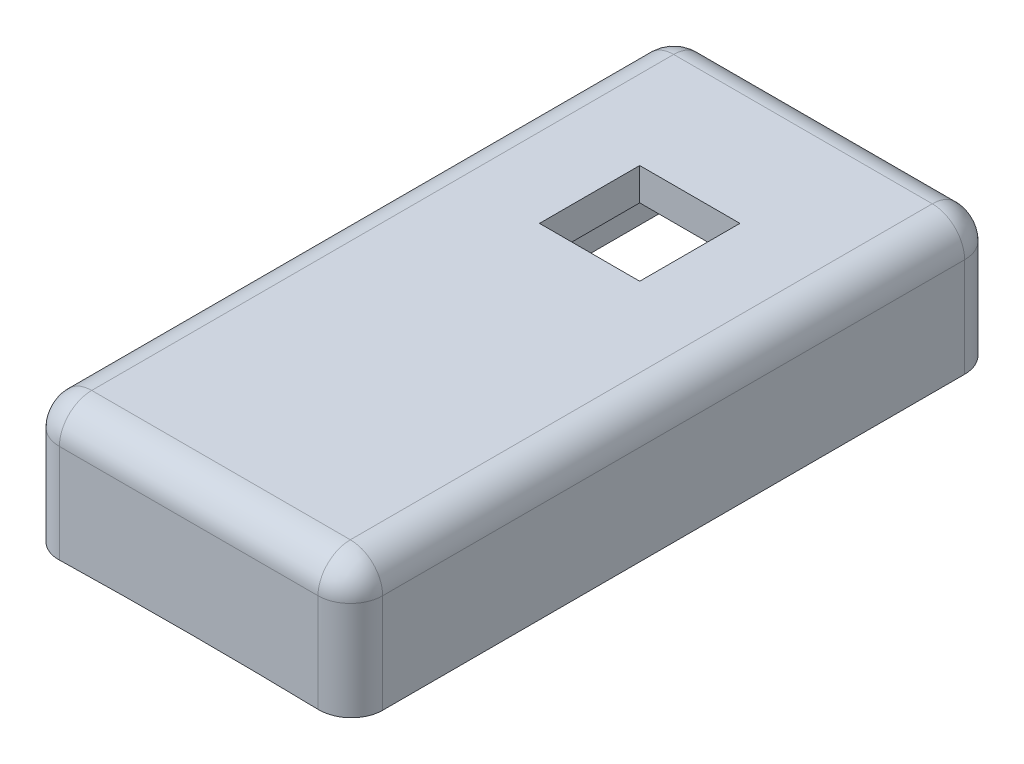
ISO-10303-21;
HEADER;
FILE_DESCRIPTION(('STEP AP214'),'2;1');
FILE_NAME('part.step','',(''),(''),'','','');
FILE_SCHEMA(('AUTOMOTIVE_DESIGN { 1 0 10303 214 1 1 1 1 }'));
ENDSEC;
DATA;
#1=APPLICATION_CONTEXT('core data for automotive mechanical design processes');
#2=APPLICATION_PROTOCOL_DEFINITION('international standard','automotive_design',2000,#1);
#3=PRODUCT_CONTEXT('',#1,'mechanical');
#4=PRODUCT('Part','Part','',(#3));
#5=PRODUCT_RELATED_PRODUCT_CATEGORY('part','',(#4));
#6=PRODUCT_DEFINITION_FORMATION('','',#4);
#7=PRODUCT_DEFINITION_CONTEXT('part definition',#1,'design');
#8=PRODUCT_DEFINITION('design','',#6,#7);
#9=PRODUCT_DEFINITION_SHAPE('','',#8);
#10=(LENGTH_UNIT() NAMED_UNIT(*) SI_UNIT(.MILLI.,.METRE.));
#11=(NAMED_UNIT(*) PLANE_ANGLE_UNIT() SI_UNIT($,.RADIAN.));
#12=(NAMED_UNIT(*) SI_UNIT($,.STERADIAN.) SOLID_ANGLE_UNIT());
#13=UNCERTAINTY_MEASURE_WITH_UNIT(LENGTH_MEASURE(1.E-05),#10,'distance_accuracy_value','');
#14=(GEOMETRIC_REPRESENTATION_CONTEXT(3) GLOBAL_UNCERTAINTY_ASSIGNED_CONTEXT((#13)) GLOBAL_UNIT_ASSIGNED_CONTEXT((#10,
#11,#12)) REPRESENTATION_CONTEXT('',''));
#15=CARTESIAN_POINT('',(0.,0.,0.));
#16=DIRECTION('',(0.,0.,1.));
#17=DIRECTION('',(1.,0.,0.));
#18=AXIS2_PLACEMENT_3D('',#15,#16,#17);
#19=CARTESIAN_POINT('',(0.,0.,100.));
#20=DIRECTION('',(0.,0.,-1.));
#21=DIRECTION('',(-1.,0.,0.));
#22=AXIS2_PLACEMENT_3D('',#19,#20,#21);
#23=CYLINDRICAL_SURFACE('',#22,915.);
#24=CARTESIAN_POINT('',(-20.,914.781394651203,100.));
#25=CARTESIAN_POINT('',(-20.1406644672354,914.778319610533,100.000015104095));
#26=CARTESIAN_POINT('',(-20.2813260189755,914.775211530138,99.9940646869272));
#27=CARTESIAN_POINT('',(-20.5616413157131,914.768953561077,99.9703422736799));
#28=CARTESIAN_POINT('',(-20.7012951087995,914.765803674428,99.9525708455042));
#29=CARTESIAN_POINT('',(-20.9785025079675,914.759488435766,99.9053335951738));
#30=CARTESIAN_POINT('',(-21.1160576122501,914.756323097142,99.8758765638301));
#31=CARTESIAN_POINT('',(-21.3881965568778,914.750000580786,99.8054823829541));
#32=CARTESIAN_POINT('',(-21.5227804332649,914.746843402956,99.7645453727602));
#33=CARTESIAN_POINT('',(-21.7880626645365,914.740563186704,99.6714663898441));
#34=CARTESIAN_POINT('',(-21.9187598327197,914.737440158889,99.6193210341405));
#35=CARTESIAN_POINT('',(-22.1753446865855,914.731255923841,99.5041820314336));
#36=CARTESIAN_POINT('',(-22.3012305766207,914.728194739886,99.441184381565));
#37=CARTESIAN_POINT('',(-22.5471790056357,914.722165384271,99.3048389735648));
#38=CARTESIAN_POINT('',(-22.6672446845895,914.719197162771,99.2314968816218));
#39=CARTESIAN_POINT('',(-22.9008158418151,914.713379310018,99.0749284612639));
#40=CARTESIAN_POINT('',(-23.0143188878349,914.710529722843,98.9916985026642));
#41=CARTESIAN_POINT('',(-23.2338614513206,914.70497961759,98.8160055422579));
#42=CARTESIAN_POINT('',(-23.3399041902866,914.70227903528,98.7235465679535));
#43=CARTESIAN_POINT('',(-23.5438643153944,914.697051961293,98.529985755192));
#44=CARTESIAN_POINT('',(-23.641778659444,914.694525534853,98.4288807093821));
#45=CARTESIAN_POINT('',(-23.8287249848049,914.689674485408,98.2187937187042));
#46=CARTESIAN_POINT('',(-23.9177584604004,914.687349828461,98.1098131043094));
#47=CARTESIAN_POINT('',(-24.086357939033,914.68292565125,97.8846944373414));
#48=CARTESIAN_POINT('',(-24.1659205652064,914.680826211314,97.7685538541275));
#49=CARTESIAN_POINT('',(-24.3149560191965,914.676876537278,97.5300056068566));
#50=CARTESIAN_POINT('',(-24.3844313432539,914.675026241534,97.4075995034641));
#51=CARTESIAN_POINT('',(-24.5128206631222,914.671594480255,97.1573656371529));
#52=CARTESIAN_POINT('',(-24.5717346177683,914.670013015769,97.0295378531047));
#53=CARTESIAN_POINT('',(-24.6785554039099,914.667137138383,96.7694270748727));
#54=CARTESIAN_POINT('',(-24.7264675610549,914.665842586608,96.6371462719744));
#55=CARTESIAN_POINT('',(-24.8109687207627,914.663554325449,96.3690654912981));
#56=CARTESIAN_POINT('',(-24.8475601992192,914.662560550284,96.2332662900641));
#57=CARTESIAN_POINT('',(-24.9187703604413,914.660623704798,95.9163109950664));
#58=CARTESIAN_POINT('',(-24.9492304166339,914.659792682776,95.7341929124362));
#59=CARTESIAN_POINT('',(-24.9796885526703,914.65896116833,95.4595566875088));
#60=CARTESIAN_POINT('',(-24.987302599877,914.658753167071,95.367814751134));
#61=CARTESIAN_POINT('',(-24.9974577189766,914.658475674299,95.1840560452749));
#62=CARTESIAN_POINT('',(-24.9999991080133,914.658406174125,95.0920392933324));
#63=CARTESIAN_POINT('',(-25.,914.65840618233,95.));
#64=B_SPLINE_CURVE_WITH_KNOTS('',3,(#24,#25,#26,#27,#28,#29,#30,#31,#32,#33,#34,#35,#36,#37,#38,
#39,#40,#41,#42,#43,#44,#45,#46,#47,#48,#49,#50,#51,#52,#53,#54,#55,#56,#57,#58,#59,#60,#61,#62,
#63),.UNSPECIFIED.,.F.,.F.,(4,2,2,2,2,2,2,2,2,2,2,2,2,2,2,2,2,2,2,4),(0.,0.421965357240429,
0.843910443932428,1.26553871113398,1.68716186103798,2.10891244734571,2.53081893062305,
2.95249520485927,3.37432677256357,3.79597505300436,4.21778043259154,4.63951471956947,
5.06139892977495,5.48317856037647,5.90495983490047,6.32653650495272,6.74802090861845,
7.30068785873599,7.57674290872782,7.85278069915381),.UNSPECIFIED.);
#65=CARTESIAN_POINT('',(-20.,914.781394651203,100.));
#66=VERTEX_POINT('',#65);
#67=CARTESIAN_POINT('',(-25.,914.65840618233,95.));
#68=VERTEX_POINT('',#67);
#69=EDGE_CURVE('E319',#66,#68,#64,.T.);
#70=ORIENTED_EDGE('',*,*,#69,.T.);
#71=CARTESIAN_POINT('',(0.,0.,95.));
#72=DIRECTION('',(0.,0.,1.));
#73=DIRECTION('',(1.,0.,0.));
#74=AXIS2_PLACEMENT_3D('',#71,#72,#73);
#75=CIRCLE('',#74,915.);
#76=CARTESIAN_POINT('',(20.,914.781394651203,95.));
#77=VERTEX_POINT('',#76);
#78=EDGE_CURVE('E230',#77,#68,#75,.T.);
#79=ORIENTED_EDGE('',*,*,#78,.F.);
#80=DIRECTION('',(0.,0.,-1.));
#81=VECTOR('',#80,1.);
#82=CARTESIAN_POINT('',(20.,914.781394651203,100.));
#83=LINE('',#82,#81);
#84=CARTESIAN_POINT('',(20.,914.781394651203,4.99999999999998));
#85=VERTEX_POINT('',#84);
#86=EDGE_CURVE('E233',#85,#77,#83,.F.);
#87=ORIENTED_EDGE('',*,*,#86,.F.);
#88=CARTESIAN_POINT('',(0.,0.,4.99999999999998));
#89=DIRECTION('',(0.,0.,-1.));
#90=DIRECTION('',(-1.,0.,0.));
#91=AXIS2_PLACEMENT_3D('',#88,#89,#90);
#92=CIRCLE('',#91,915.);
#93=CARTESIAN_POINT('',(-20.,914.781394651203,4.99999999999998));
#94=VERTEX_POINT('',#93);
#95=EDGE_CURVE('E238',#94,#85,#92,.T.);
#96=ORIENTED_EDGE('',*,*,#95,.F.);
#97=DIRECTION('',(0.,0.,-1.));
#98=VECTOR('',#97,1.);
#99=CARTESIAN_POINT('',(-20.,914.781394651203,100.));
#100=LINE('',#99,#98);
#101=CARTESIAN_POINT('',(-20.,914.781394651203,80.));
#102=VERTEX_POINT('',#101);
#103=EDGE_CURVE('E241',#102,#94,#100,.T.);
#104=ORIENTED_EDGE('',*,*,#103,.F.);
#105=CARTESIAN_POINT('',(0.,0.,80.));
#106=DIRECTION('',(0.,0.,-1.));
#107=DIRECTION('',(-1.,0.,0.));
#108=AXIS2_PLACEMENT_3D('',#105,#106,#107);
#109=CIRCLE('',#108,915.);
#110=CARTESIAN_POINT('',(-25.,914.65840618233,80.));
#111=VERTEX_POINT('',#110);
#112=EDGE_CURVE('E375',#111,#102,#109,.T.);
#113=ORIENTED_EDGE('',*,*,#112,.F.);
#114=DIRECTION('',(0.,0.,-1.));
#115=VECTOR('',#114,1.);
#116=CARTESIAN_POINT('',(-25.,914.65840618233,100.));
#117=LINE('',#116,#115);
#118=CARTESIAN_POINT('',(-25.,914.65840618233,5.));
#119=VERTEX_POINT('',#118);
#120=EDGE_CURVE('E249',#111,#119,#117,.T.);
#121=ORIENTED_EDGE('',*,*,#120,.T.);
#122=CARTESIAN_POINT('',(-25.,914.65840618233,5.));
#123=CARTESIAN_POINT('',(-25.0000151500655,914.658405523971,4.85940565498046));
#124=CARTESIAN_POINT('',(-24.9940706053862,914.658568240483,4.7188135037489));
#125=CARTESIAN_POINT('',(-24.9703715631628,914.659215666626,4.43863544517455));
#126=CARTESIAN_POINT('',(-24.9526176424691,914.659700360531,4.29904948901896));
#127=CARTESIAN_POINT('',(-24.9054273719519,914.660986492212,4.02197806077414));
#128=CARTESIAN_POINT('',(-24.8759999942426,914.661787686728,3.8844910595297));
#129=CARTESIAN_POINT('',(-24.8056773368275,914.66369755027,3.61248595673334));
#130=CARTESIAN_POINT('',(-24.7647821951351,914.664806215597,3.4779678194725));
#131=CARTESIAN_POINT('',(-24.6717998048681,914.66731900392,3.21281472629095));
#132=CARTESIAN_POINT('',(-24.6197092259708,914.66872321483,3.08218093904498));
#133=CARTESIAN_POINT('',(-24.5046930582283,914.671811814179,2.82571899391899));
#134=CARTESIAN_POINT('',(-24.4417634715222,914.67349630599,2.69989263020681));
#135=CARTESIAN_POINT('',(-24.3055676598232,914.677125556613,2.4540576296132));
#136=CARTESIAN_POINT('',(-24.2323070556181,914.67907017387,2.33404587657253));
#137=CARTESIAN_POINT('',(-24.0759156644583,914.683200022394,2.10057585809348));
#138=CARTESIAN_POINT('',(-23.9927812511617,914.685385342041,1.9871200233217));
#139=CARTESIAN_POINT('',(-23.8172725125381,914.689972193725,1.76763697028814));
#140=CARTESIAN_POINT('',(-23.7249000037434,914.692373683246,1.66160829853182));
#141=CARTESIAN_POINT('',(-23.5315220091746,914.697368984657,1.45766938668389));
#142=CARTESIAN_POINT('',(-23.4305133205398,914.699962867853,1.35976218531879));
#143=CARTESIAN_POINT('',(-23.2206284426376,914.705315076923,1.1728210426859));
#144=CARTESIAN_POINT('',(-23.1117535726432,914.708073375208,1.0837856194236));
#145=CARTESIAN_POINT('',(-22.8868551315034,914.713728177753,0.91517109753272));
#146=CARTESIAN_POINT('',(-22.7708290310888,914.716624730828,0.835595374121958));
#147=CARTESIAN_POINT('',(-22.532445629495,914.722527934553,0.686475758726517));
#148=CARTESIAN_POINT('',(-22.4100861233666,914.725534623438,0.616935392863884));
#149=CARTESIAN_POINT('',(-22.1599447501427,914.731628676084,0.488413528246855));
#150=CARTESIAN_POINT('',(-22.0321628583895,914.734716040212,0.429432077514362));
#151=CARTESIAN_POINT('',(-21.772141429631,914.740941880953,0.322472502716281));
#152=CARTESIAN_POINT('',(-21.6399040553157,914.744080332395,0.274489125988823));
#153=CARTESIAN_POINT('',(-21.3719072321286,914.750381011985,0.18984137658345));
#154=CARTESIAN_POINT('',(-21.2361485547716,914.753543234818,0.153174546791944));
#155=CARTESIAN_POINT('',(-20.9187676893903,914.760863613192,0.0816692081977026));
#156=CARTESIAN_POINT('',(-20.7361685641225,914.765021730698,0.0510445183005125));
#157=CARTESIAN_POINT('',(-20.4607983467186,914.771208655837,0.0204215585679653));
#158=CARTESIAN_POINT('',(-20.3688096302651,914.773261569656,0.0127662580230642));
#159=CARTESIAN_POINT('',(-20.1845549434616,914.777345716666,0.00255609823413704));
#160=CARTESIAN_POINT('',(-20.0922889911654,914.779376951231,9.13778196868483E-07));
#161=CARTESIAN_POINT('',(-20.,914.781394651203,0.));
#162=B_SPLINE_CURVE_WITH_KNOTS('',3,(#122,#123,#124,#125,#126,#127,#128,#129,#130,#131,#132,
#133,#134,#135,#136,#137,#138,#139,#140,#141,#142,#143,#144,#145,#146,#147,#148,#149,#150,#151,
#152,#153,#154,#155,#156,#157,#158,#159,#160,#161),.UNSPECIFIED.,.F.,.F.,(4,2,2,2,2,2,2,2,2,2,2,
2,2,2,2,2,2,2,2,4),(0.,0.421654227005286,0.843287859057121,1.26459805322751,1.68590317719354,
2.10733380128971,2.5289202000806,2.95027810538405,3.37179124363104,3.79322166002785,
4.21480905403933,4.63632590510775,5.05799270469331,5.47980730640222,5.90162382647356,
6.32323846593309,6.7447614974969,7.29905805460504,7.57592811309421,7.85278051623653),.UNSPECIFIED.);
#163=CARTESIAN_POINT('',(-20.,914.781394651203,0.));
#164=VERTEX_POINT('',#163);
#165=EDGE_CURVE('E58',#119,#164,#162,.T.);
#166=ORIENTED_EDGE('',*,*,#165,.T.);
#167=CARTESIAN_POINT('',(0.,0.,0.));
#168=DIRECTION('',(0.,0.,1.));
#169=DIRECTION('',(1.,0.,0.));
#170=AXIS2_PLACEMENT_3D('',#167,#168,#169);
#171=CIRCLE('',#170,915.);
#172=CARTESIAN_POINT('',(20.,914.781394651203,0.));
#173=VERTEX_POINT('',#172);
#174=EDGE_CURVE('E244',#173,#164,#171,.T.);
#175=ORIENTED_EDGE('',*,*,#174,.F.);
#176=CARTESIAN_POINT('',(20.,914.781394651203,0.));
#177=CARTESIAN_POINT('',(20.1406644672354,914.778319610533,-1.51040950419277E-05));
#178=CARTESIAN_POINT('',(20.2813260189755,914.775211530138,0.00593531307278657));
#179=CARTESIAN_POINT('',(20.5616413157131,914.768953561077,0.0296577263200531));
#180=CARTESIAN_POINT('',(20.7012951087995,914.765803674428,0.0474291544958041));
#181=CARTESIAN_POINT('',(20.9785025079675,914.759488435766,0.0946664048262205));
#182=CARTESIAN_POINT('',(21.1160576122501,914.756323097142,0.124123436169895));
#183=CARTESIAN_POINT('',(21.3881965568778,914.750000580786,0.194517617045909));
#184=CARTESIAN_POINT('',(21.5227804332649,914.746843402956,0.235454627239843));
#185=CARTESIAN_POINT('',(21.7880626645365,914.740563186704,0.328533610155889));
#186=CARTESIAN_POINT('',(21.9187598327197,914.737440158889,0.380678965859513));
#187=CARTESIAN_POINT('',(22.1753446865854,914.731255923841,0.495817968566393));
#188=CARTESIAN_POINT('',(22.3012305766207,914.728194739886,0.558815618434986));
#189=CARTESIAN_POINT('',(22.5471790056357,914.722165384271,0.695161026435217));
#190=CARTESIAN_POINT('',(22.6672446845895,914.719197162771,0.76850311837824));
#191=CARTESIAN_POINT('',(22.9008158418151,914.713379310018,0.925071538736074));
#192=CARTESIAN_POINT('',(23.0143188878349,914.710529722843,1.00830149733582));
#193=CARTESIAN_POINT('',(23.2338614513206,914.70497961759,1.18399445774212));
#194=CARTESIAN_POINT('',(23.3399041902866,914.70227903528,1.27645343204646));
#195=CARTESIAN_POINT('',(23.5438643153944,914.697051961293,1.47001424480804));
#196=CARTESIAN_POINT('',(23.641778659444,914.694525534853,1.5711192906179));
#197=CARTESIAN_POINT('',(23.8287249848049,914.689674485408,1.78120628129581));
#198=CARTESIAN_POINT('',(23.9177584604004,914.687349828461,1.89018689569062));
#199=CARTESIAN_POINT('',(24.086357939033,914.68292565125,2.11530556265864));
#200=CARTESIAN_POINT('',(24.1659205652064,914.680826211314,2.23144614587253));
#201=CARTESIAN_POINT('',(24.3149560191965,914.676876537278,2.46999439314335));
#202=CARTESIAN_POINT('',(24.3844313432539,914.675026241534,2.59240049653593));
#203=CARTESIAN_POINT('',(24.5128206631222,914.671594480255,2.84263436284712));
#204=CARTESIAN_POINT('',(24.5717346177683,914.670013015769,2.97046214689526));
#205=CARTESIAN_POINT('',(24.6785554039099,914.667137138383,3.23057292512726));
#206=CARTESIAN_POINT('',(24.7264675610549,914.665842586608,3.36285372802563));
#207=CARTESIAN_POINT('',(24.8109687207627,914.663554325449,3.63093450870186));
#208=CARTESIAN_POINT('',(24.8475601992192,914.662560550284,3.76673370993591));
#209=CARTESIAN_POINT('',(24.9187703604413,914.660623704798,4.08368900493355));
#210=CARTESIAN_POINT('',(24.9492304166338,914.659792682776,4.26580708756378));
#211=CARTESIAN_POINT('',(24.9796885526703,914.65896116833,4.54044331249123));
#212=CARTESIAN_POINT('',(24.987302599877,914.658753167071,4.63218524886599));
#213=CARTESIAN_POINT('',(24.9974577189766,914.658475674299,4.81594395472508));
#214=CARTESIAN_POINT('',(24.9999991080133,914.658406174125,4.90796070666762));
#215=CARTESIAN_POINT('',(25.,914.65840618233,5.));
#216=B_SPLINE_CURVE_WITH_KNOTS('',3,(#176,#177,#178,#179,#180,#181,#182,#183,#184,#185,#186,
#187,#188,#189,#190,#191,#192,#193,#194,#195,#196,#197,#198,#199,#200,#201,#202,#203,#204,#205,
#206,#207,#208,#209,#210,#211,#212,#213,#214,#215),.UNSPECIFIED.,.F.,.F.,(4,2,2,2,2,2,2,2,2,2,2,
2,2,2,2,2,2,2,2,4),(0.,0.421965357240425,0.843910443932423,1.26553871113397,1.68716186103797,
2.1089124473457,2.53081893062304,2.95249520485927,3.37432677256357,3.79597505300435,
4.21778043259155,4.63951471956947,5.06139892977494,5.48317856037646,5.90495983490046,
6.32653650495271,6.74802090861844,7.30068785873598,7.5767429087278,7.85278069915381),.UNSPECIFIED.);
#217=CARTESIAN_POINT('',(25.,914.65840618233,5.));
#218=VERTEX_POINT('',#217);
#219=EDGE_CURVE('E11',#173,#218,#216,.T.);
#220=ORIENTED_EDGE('',*,*,#219,.T.);
#221=DIRECTION('',(0.,0.,-1.));
#222=VECTOR('',#221,1.);
#223=CARTESIAN_POINT('',(25.,914.65840618233,100.));
#224=LINE('',#223,#222);
#225=CARTESIAN_POINT('',(25.,914.65840618233,95.));
#226=VERTEX_POINT('',#225);
#227=EDGE_CURVE('E255',#226,#218,#224,.T.);
#228=ORIENTED_EDGE('',*,*,#227,.F.);
#229=CARTESIAN_POINT('',(25.,914.65840618233,95.));
#230=CARTESIAN_POINT('',(25.0000151500655,914.658405523971,95.1405943450196));
#231=CARTESIAN_POINT('',(24.9940706053862,914.658568240483,95.2811864962511));
#232=CARTESIAN_POINT('',(24.9703715631628,914.659215666626,95.5613645548255));
#233=CARTESIAN_POINT('',(24.9526176424691,914.659700360531,95.7009505109811));
#234=CARTESIAN_POINT('',(24.9054273719519,914.660986492212,95.9780219392259));
#235=CARTESIAN_POINT('',(24.8759999942426,914.661787686728,96.1155089404703));
#236=CARTESIAN_POINT('',(24.8056773368275,914.66369755027,96.3875140432667));
#237=CARTESIAN_POINT('',(24.7647821951351,914.664806215597,96.5220321805275));
#238=CARTESIAN_POINT('',(24.6717998048681,914.66731900392,96.7871852737091));
#239=CARTESIAN_POINT('',(24.6197092259708,914.66872321483,96.917819060955));
#240=CARTESIAN_POINT('',(24.5046930582283,914.671811814179,97.174281006081));
#241=CARTESIAN_POINT('',(24.4417634715222,914.67349630599,97.3001073697932));
#242=CARTESIAN_POINT('',(24.3055676598232,914.677125556613,97.5459423703868));
#243=CARTESIAN_POINT('',(24.2323070556181,914.67907017387,97.6659541234275));
#244=CARTESIAN_POINT('',(24.0759156644583,914.683200022394,97.8994241419065));
#245=CARTESIAN_POINT('',(23.9927812511617,914.685385342041,98.0128799766783));
#246=CARTESIAN_POINT('',(23.8172725125381,914.689972193725,98.2323630297119));
#247=CARTESIAN_POINT('',(23.7249000037434,914.692373683246,98.3383917014682));
#248=CARTESIAN_POINT('',(23.5315220091746,914.697368984657,98.5423306133161));
#249=CARTESIAN_POINT('',(23.4305133205398,914.699962867853,98.6402378146812));
#250=CARTESIAN_POINT('',(23.2206284426376,914.705315076923,98.8271789573141));
#251=CARTESIAN_POINT('',(23.1117535726432,914.708073375208,98.9162143805764));
#252=CARTESIAN_POINT('',(22.8868551315034,914.713728177753,99.0848289024673));
#253=CARTESIAN_POINT('',(22.7708290310888,914.716624730828,99.164404625878));
#254=CARTESIAN_POINT('',(22.5324456294951,914.722527934553,99.3135242412735));
#255=CARTESIAN_POINT('',(22.4100861233666,914.725534623438,99.3830646071361));
#256=CARTESIAN_POINT('',(22.1599447501427,914.731628676084,99.5115864717531));
#257=CARTESIAN_POINT('',(22.0321628583895,914.734716040212,99.5705679224856));
#258=CARTESIAN_POINT('',(21.772141429631,914.740941880953,99.6775274972837));
#259=CARTESIAN_POINT('',(21.6399040553157,914.744080332395,99.7255108740112));
#260=CARTESIAN_POINT('',(21.3719072321286,914.750381011985,99.8101586234166));
#261=CARTESIAN_POINT('',(21.2361485547716,914.753543234818,99.8468254532081));
#262=CARTESIAN_POINT('',(20.9187676893903,914.760863613192,99.9183307918023));
#263=CARTESIAN_POINT('',(20.7361685641225,914.765021730698,99.9489554816995));
#264=CARTESIAN_POINT('',(20.4607983467186,914.771208655837,99.979578441432));
#265=CARTESIAN_POINT('',(20.3688096302651,914.773261569656,99.987233741977));
#266=CARTESIAN_POINT('',(20.1845549434616,914.777345716666,99.9974439017659));
#267=CARTESIAN_POINT('',(20.0922889911654,914.779376951231,99.9999990862218));
#268=CARTESIAN_POINT('',(20.,914.781394651203,100.));
#269=B_SPLINE_CURVE_WITH_KNOTS('',3,(#229,#230,#231,#232,#233,#234,#235,#236,#237,#238,#239,
#240,#241,#242,#243,#244,#245,#246,#247,#248,#249,#250,#251,#252,#253,#254,#255,#256,#257,#258,
#259,#260,#261,#262,#263,#264,#265,#266,#267,#268),.UNSPECIFIED.,.F.,.F.,(4,2,2,2,2,2,2,2,2,2,2,
2,2,2,2,2,2,2,2,4),(0.,0.421654227005288,0.84328785905713,1.26459805322752,1.68590317719353,
2.10733380128972,2.52892020008061,2.95027810538405,3.37179124363104,3.79322166002784,
4.21480905403932,4.63632590510775,5.05799270469331,5.47980730640222,5.90162382647356,
6.32323846593309,6.74476149749689,7.29905805460503,7.57592811309421,7.85278051623653),.UNSPECIFIED.);
#270=CARTESIAN_POINT('',(20.,914.781394651203,100.));
#271=VERTEX_POINT('',#270);
#272=EDGE_CURVE('E310',#226,#271,#269,.T.);
#273=ORIENTED_EDGE('',*,*,#272,.T.);
#274=CARTESIAN_POINT('',(0.,0.,100.));
#275=DIRECTION('',(0.,0.,1.));
#276=DIRECTION('',(1.,0.,0.));
#277=AXIS2_PLACEMENT_3D('',#274,#275,#276);
#278=CIRCLE('',#277,915.);
#279=EDGE_CURVE('E245',#271,#66,#278,.T.);
#280=ORIENTED_EDGE('',*,*,#279,.T.);
#281=EDGE_LOOP('',(#70,#79,#87,#96,#104,#113,#121,#166,#175,#220,#228,#273,#280));
#282=FACE_BOUND('',#281,.T.);
#283=ADVANCED_FACE('F47',(#282),#23,.F.);
#284=CARTESIAN_POINT('',(24.9999999999998,0.,100.));
#285=DIRECTION('',(1.,0.,0.));
#286=DIRECTION('',(0.,1.,0.));
#287=AXIS2_PLACEMENT_3D('',#284,#285,#286);
#288=PLANE('',#287);
#289=ORIENTED_EDGE('',*,*,#227,.T.);
#290=DIRECTION('',(0.,-1.,0.));
#291=VECTOR('',#290,1.);
#292=CARTESIAN_POINT('',(25.,935.,5.));
#293=LINE('',#292,#291);
#294=CARTESIAN_POINT('',(25.,930.,5.));
#295=VERTEX_POINT('',#294);
#296=EDGE_CURVE('E66',#218,#295,#293,.F.);
#297=ORIENTED_EDGE('',*,*,#296,.T.);
#298=DIRECTION('',(0.,0.,-1.));
#299=VECTOR('',#298,1.);
#300=CARTESIAN_POINT('',(25.,930.,100.));
#301=LINE('',#300,#299);
#302=CARTESIAN_POINT('',(25.,930.,95.));
#303=VERTEX_POINT('',#302);
#304=EDGE_CURVE('E71',#295,#303,#301,.F.);
#305=ORIENTED_EDGE('',*,*,#304,.T.);
#306=DIRECTION('',(0.,-1.,0.));
#307=VECTOR('',#306,1.);
#308=CARTESIAN_POINT('',(24.9999999999998,0.,95.));
#309=LINE('',#308,#307);
#310=EDGE_CURVE('E303',#303,#226,#309,.T.);
#311=ORIENTED_EDGE('',*,*,#310,.T.);
#312=EDGE_LOOP('',(#289,#297,#305,#311));
#313=FACE_BOUND('',#312,.T.);
#314=ADVANCED_FACE('F492',(#313),#288,.T.);
#315=CARTESIAN_POINT('',(0.,935.,100.));
#316=DIRECTION('',(0.,1.,0.));
#317=DIRECTION('',(0.,0.,1.));
#318=AXIS2_PLACEMENT_3D('',#315,#316,#317);
#319=PLANE('',#318);
#320=DIRECTION('',(0.,0.,-1.));
#321=VECTOR('',#320,1.);
#322=CARTESIAN_POINT('',(-20.,935.,100.));
#323=LINE('',#322,#321);
#324=CARTESIAN_POINT('',(-20.,935.,5.));
#325=VERTEX_POINT('',#324);
#326=CARTESIAN_POINT('',(-20.,935.,95.));
#327=VERTEX_POINT('',#326);
#328=EDGE_CURVE('E267',#325,#327,#323,.F.);
#329=ORIENTED_EDGE('',*,*,#328,.T.);
#330=DIRECTION('',(1.,0.,0.));
#331=VECTOR('',#330,1.);
#332=CARTESIAN_POINT('',(0.,935.,95.));
#333=LINE('',#332,#331);
#334=CARTESIAN_POINT('',(20.,935.,95.));
#335=VERTEX_POINT('',#334);
#336=EDGE_CURVE('E270',#327,#335,#333,.T.);
#337=ORIENTED_EDGE('',*,*,#336,.T.);
#338=DIRECTION('',(0.,0.,-1.));
#339=VECTOR('',#338,1.);
#340=CARTESIAN_POINT('',(20.,935.,100.));
#341=LINE('',#340,#339);
#342=CARTESIAN_POINT('',(20.,935.,5.));
#343=VERTEX_POINT('',#342);
#344=EDGE_CURVE('E261',#335,#343,#341,.T.);
#345=ORIENTED_EDGE('',*,*,#344,.T.);
#346=DIRECTION('',(1.,0.,0.));
#347=VECTOR('',#346,1.);
#348=CARTESIAN_POINT('',(-25.,935.,5.));
#349=LINE('',#348,#347);
#350=EDGE_CURVE('E264',#343,#325,#349,.F.);
#351=ORIENTED_EDGE('',*,*,#350,.T.);
#352=EDGE_LOOP('',(#329,#337,#345,#351));
#353=FACE_BOUND('',#352,.T.);
#354=DIRECTION('',(1.,0.,0.));
#355=VECTOR('',#354,1.);
#356=CARTESIAN_POINT('',(-7.75,935.,38.));
#357=LINE('',#356,#355);
#358=CARTESIAN_POINT('',(-7.75,935.,38.));
#359=VERTEX_POINT('',#358);
#360=CARTESIAN_POINT('',(7.75,935.,38.));
#361=VERTEX_POINT('',#360);
#362=EDGE_CURVE('E419',#359,#361,#357,.T.);
#363=ORIENTED_EDGE('',*,*,#362,.F.);
#364=DIRECTION('',(0.,0.,1.));
#365=VECTOR('',#364,1.);
#366=CARTESIAN_POINT('',(-7.75,935.,22.5));
#367=LINE('',#366,#365);
#368=CARTESIAN_POINT('',(-7.75,935.,22.5));
#369=VERTEX_POINT('',#368);
#370=EDGE_CURVE('E416',#369,#359,#367,.T.);
#371=ORIENTED_EDGE('',*,*,#370,.F.);
#372=DIRECTION('',(-1.,0.,0.));
#373=VECTOR('',#372,1.);
#374=CARTESIAN_POINT('',(-7.75,935.,22.5));
#375=LINE('',#374,#373);
#376=CARTESIAN_POINT('',(7.75,935.,22.5));
#377=VERTEX_POINT('',#376);
#378=EDGE_CURVE('E435',#377,#369,#375,.T.);
#379=ORIENTED_EDGE('',*,*,#378,.F.);
#380=DIRECTION('',(0.,0.,-1.));
#381=VECTOR('',#380,1.);
#382=CARTESIAN_POINT('',(7.75,935.,22.5));
#383=LINE('',#382,#381);
#384=EDGE_CURVE('E426',#361,#377,#383,.T.);
#385=ORIENTED_EDGE('',*,*,#384,.F.);
#386=EDGE_LOOP('',(#363,#371,#379,#385));
#387=FACE_BOUND('',#386,.T.);
#388=ADVANCED_FACE('F498',(#353,#387),#319,.T.);
#389=CARTESIAN_POINT('',(-24.9999999999998,0.,100.));
#390=DIRECTION('',(1.,0.,0.));
#391=DIRECTION('',(0.,1.,0.));
#392=AXIS2_PLACEMENT_3D('',#389,#390,#391);
#393=PLANE('',#392);
#394=ORIENTED_EDGE('',*,*,#120,.F.);
#395=DIRECTION('',(0.,-1.,0.));
#396=VECTOR('',#395,1.);
#397=CARTESIAN_POINT('',(-25.,914.65840618233,80.));
#398=LINE('',#397,#396);
#399=CARTESIAN_POINT('',(-25.,919.65840618233,80.));
#400=VERTEX_POINT('',#399);
#401=EDGE_CURVE('E212',#400,#111,#398,.T.);
#402=ORIENTED_EDGE('',*,*,#401,.F.);
#403=DIRECTION('',(0.,0.,-1.));
#404=VECTOR('',#403,1.);
#405=CARTESIAN_POINT('',(-25.,919.65840618233,95.));
#406=LINE('',#405,#404);
#407=CARTESIAN_POINT('',(-25.,919.65840618233,95.));
#408=VERTEX_POINT('',#407);
#409=EDGE_CURVE('E696',#408,#400,#406,.T.);
#410=ORIENTED_EDGE('',*,*,#409,.F.);
#411=DIRECTION('',(0.,-1.,0.));
#412=VECTOR('',#411,1.);
#413=CARTESIAN_POINT('',(-25.,935.,95.));
#414=LINE('',#413,#412);
#415=CARTESIAN_POINT('',(-25.,930.,95.));
#416=VERTEX_POINT('',#415);
#417=EDGE_CURVE('E284',#408,#416,#414,.F.);
#418=ORIENTED_EDGE('',*,*,#417,.T.);
#419=DIRECTION('',(0.,0.,-1.));
#420=VECTOR('',#419,1.);
#421=CARTESIAN_POINT('',(-25.,930.,0.));
#422=LINE('',#421,#420);
#423=CARTESIAN_POINT('',(-25.,930.,5.));
#424=VERTEX_POINT('',#423);
#425=EDGE_CURVE('E287',#416,#424,#422,.T.);
#426=ORIENTED_EDGE('',*,*,#425,.T.);
#427=DIRECTION('',(0.,-1.,0.));
#428=VECTOR('',#427,1.);
#429=CARTESIAN_POINT('',(-24.9999999999998,0.,5.));
#430=LINE('',#429,#428);
#431=EDGE_CURVE('E290',#424,#119,#430,.T.);
#432=ORIENTED_EDGE('',*,*,#431,.T.);
#433=EDGE_LOOP('',(#394,#402,#410,#418,#426,#432));
#434=FACE_BOUND('',#433,.T.);
#435=ADVANCED_FACE('F503',(#434),#393,.F.);
#436=CARTESIAN_POINT('',(0.,0.,100.));
#437=DIRECTION('',(0.,0.,1.));
#438=DIRECTION('',(1.,0.,0.));
#439=AXIS2_PLACEMENT_3D('',#436,#437,#438);
#440=PLANE('',#439);
#441=DIRECTION('',(1.,0.,0.));
#442=VECTOR('',#441,1.);
#443=CARTESIAN_POINT('',(0.,930.,100.));
#444=LINE('',#443,#442);
#445=CARTESIAN_POINT('',(20.,930.,100.));
#446=VERTEX_POINT('',#445);
#447=CARTESIAN_POINT('',(-20.,930.,100.));
#448=VERTEX_POINT('',#447);
#449=EDGE_CURVE('E277',#446,#448,#444,.F.);
#450=ORIENTED_EDGE('',*,*,#449,.T.);
#451=DIRECTION('',(0.,-1.,0.));
#452=VECTOR('',#451,1.);
#453=CARTESIAN_POINT('',(-20.,914.65840618233,100.));
#454=LINE('',#453,#452);
#455=EDGE_CURVE('E281',#448,#66,#454,.T.);
#456=ORIENTED_EDGE('',*,*,#455,.T.);
#457=ORIENTED_EDGE('',*,*,#279,.F.);
#458=DIRECTION('',(0.,-1.,0.));
#459=VECTOR('',#458,1.);
#460=CARTESIAN_POINT('',(19.9999999999998,0.,100.));
#461=LINE('',#460,#459);
#462=EDGE_CURVE('E274',#271,#446,#461,.F.);
#463=ORIENTED_EDGE('',*,*,#462,.T.);
#464=EDGE_LOOP('',(#450,#456,#457,#463));
#465=FACE_BOUND('',#464,.T.);
#466=ADVANCED_FACE('F508',(#465),#440,.T.);
#467=CARTESIAN_POINT('',(0.,0.,0.));
#468=DIRECTION('',(0.,0.,1.));
#469=DIRECTION('',(1.,0.,0.));
#470=AXIS2_PLACEMENT_3D('',#467,#468,#469);
#471=PLANE('',#470);
#472=DIRECTION('',(1.,0.,0.));
#473=VECTOR('',#472,1.);
#474=CARTESIAN_POINT('',(25.,930.,0.));
#475=LINE('',#474,#473);
#476=CARTESIAN_POINT('',(-20.,930.,0.));
#477=VERTEX_POINT('',#476);
#478=CARTESIAN_POINT('',(20.,930.,0.));
#479=VERTEX_POINT('',#478);
#480=EDGE_CURVE('E297',#477,#479,#475,.T.);
#481=ORIENTED_EDGE('',*,*,#480,.T.);
#482=DIRECTION('',(0.,-1.,0.));
#483=VECTOR('',#482,1.);
#484=CARTESIAN_POINT('',(20.,914.65840618233,0.));
#485=LINE('',#484,#483);
#486=EDGE_CURVE('E300',#479,#173,#485,.T.);
#487=ORIENTED_EDGE('',*,*,#486,.T.);
#488=ORIENTED_EDGE('',*,*,#174,.T.);
#489=DIRECTION('',(0.,-1.,0.));
#490=VECTOR('',#489,1.);
#491=CARTESIAN_POINT('',(-19.9999999999998,0.,0.));
#492=LINE('',#491,#490);
#493=EDGE_CURVE('E294',#164,#477,#492,.F.);
#494=ORIENTED_EDGE('',*,*,#493,.T.);
#495=EDGE_LOOP('',(#481,#487,#488,#494));
#496=FACE_BOUND('',#495,.T.);
#497=ADVANCED_FACE('F510',(#496),#471,.F.);
#498=CARTESIAN_POINT('',(-20.,785.,4.99999999999998));
#499=DIRECTION('',(-1.,0.,0.));
#500=DIRECTION('',(0.,0.,1.));
#501=AXIS2_PLACEMENT_3D('',#498,#499,#500);
#502=PLANE('',#501);
#503=DIRECTION('',(0.,0.,-1.));
#504=VECTOR('',#503,1.);
#505=CARTESIAN_POINT('',(-20.,919.65840618233,95.));
#506=LINE('',#505,#504);
#507=CARTESIAN_POINT('',(-20.,919.65840618233,95.));
#508=VERTEX_POINT('',#507);
#509=CARTESIAN_POINT('',(-20.,919.65840618233,80.));
#510=VERTEX_POINT('',#509);
#511=EDGE_CURVE('E206',#508,#510,#506,.T.);
#512=ORIENTED_EDGE('',*,*,#511,.T.);
#513=DIRECTION('',(0.,-1.,0.));
#514=VECTOR('',#513,1.);
#515=CARTESIAN_POINT('',(-20.,914.65840618233,80.));
#516=LINE('',#515,#514);
#517=EDGE_CURVE('E203',#510,#102,#516,.T.);
#518=ORIENTED_EDGE('',*,*,#517,.T.);
#519=ORIENTED_EDGE('',*,*,#103,.T.);
#520=DIRECTION('',(0.,1.,0.));
#521=VECTOR('',#520,1.);
#522=CARTESIAN_POINT('',(-20.,785.,4.99999999999998));
#523=LINE('',#522,#521);
#524=CARTESIAN_POINT('',(-20.,930.,4.99999999999998));
#525=VERTEX_POINT('',#524);
#526=EDGE_CURVE('E234',#94,#525,#523,.T.);
#527=ORIENTED_EDGE('',*,*,#526,.T.);
#528=DIRECTION('',(0.,0.,1.));
#529=VECTOR('',#528,1.);
#530=CARTESIAN_POINT('',(-20.,930.,4.99999999999998));
#531=LINE('',#530,#529);
#532=CARTESIAN_POINT('',(-20.,930.,95.));
#533=VERTEX_POINT('',#532);
#534=EDGE_CURVE('E217',#525,#533,#531,.T.);
#535=ORIENTED_EDGE('',*,*,#534,.T.);
#536=DIRECTION('',(0.,1.,0.));
#537=VECTOR('',#536,1.);
#538=CARTESIAN_POINT('',(-20.,785.,95.));
#539=LINE('',#538,#537);
#540=EDGE_CURVE('E194',#508,#533,#539,.T.);
#541=ORIENTED_EDGE('',*,*,#540,.F.);
#542=EDGE_LOOP('',(#512,#518,#519,#527,#535,#541));
#543=FACE_BOUND('',#542,.T.);
#544=ADVANCED_FACE('F215',(#543),#502,.F.);
#545=CARTESIAN_POINT('',(-20.,785.,4.99999999999998));
#546=DIRECTION('',(0.,0.,-1.));
#547=DIRECTION('',(-1.,0.,0.));
#548=AXIS2_PLACEMENT_3D('',#545,#546,#547);
#549=PLANE('',#548);
#550=DIRECTION('',(0.,1.,0.));
#551=VECTOR('',#550,1.);
#552=CARTESIAN_POINT('',(20.,785.,4.99999999999998));
#553=LINE('',#552,#551);
#554=CARTESIAN_POINT('',(20.,930.,4.99999999999998));
#555=VERTEX_POINT('',#554);
#556=EDGE_CURVE('E224',#85,#555,#553,.T.);
#557=ORIENTED_EDGE('',*,*,#556,.T.);
#558=DIRECTION('',(-1.,0.,0.));
#559=VECTOR('',#558,1.);
#560=CARTESIAN_POINT('',(-20.,930.,4.99999999999998));
#561=LINE('',#560,#559);
#562=EDGE_CURVE('E226',#555,#525,#561,.T.);
#563=ORIENTED_EDGE('',*,*,#562,.T.);
#564=ORIENTED_EDGE('',*,*,#526,.F.);
#565=ORIENTED_EDGE('',*,*,#95,.T.);
#566=EDGE_LOOP('',(#557,#563,#564,#565));
#567=FACE_BOUND('',#566,.T.);
#568=ADVANCED_FACE('F464',(#567),#549,.F.);
#569=CARTESIAN_POINT('',(20.,785.,4.99999999999998));
#570=DIRECTION('',(1.,0.,0.));
#571=DIRECTION('',(0.,0.,-1.));
#572=AXIS2_PLACEMENT_3D('',#569,#570,#571);
#573=PLANE('',#572);
#574=DIRECTION('',(0.,1.,0.));
#575=VECTOR('',#574,1.);
#576=CARTESIAN_POINT('',(20.,785.,95.));
#577=LINE('',#576,#575);
#578=CARTESIAN_POINT('',(20.,930.,95.));
#579=VERTEX_POINT('',#578);
#580=EDGE_CURVE('E219',#77,#579,#577,.T.);
#581=ORIENTED_EDGE('',*,*,#580,.T.);
#582=DIRECTION('',(0.,0.,-1.));
#583=VECTOR('',#582,1.);
#584=CARTESIAN_POINT('',(20.,930.,4.99999999999998));
#585=LINE('',#584,#583);
#586=EDGE_CURVE('E443',#579,#555,#585,.T.);
#587=ORIENTED_EDGE('',*,*,#586,.T.);
#588=ORIENTED_EDGE('',*,*,#556,.F.);
#589=ORIENTED_EDGE('',*,*,#86,.T.);
#590=EDGE_LOOP('',(#581,#587,#588,#589));
#591=FACE_BOUND('',#590,.T.);
#592=ADVANCED_FACE('F469',(#591),#573,.F.);
#593=CARTESIAN_POINT('',(-20.,785.,95.));
#594=DIRECTION('',(0.,0.,1.));
#595=DIRECTION('',(1.,0.,0.));
#596=AXIS2_PLACEMENT_3D('',#593,#594,#595);
#597=PLANE('',#596);
#598=ORIENTED_EDGE('',*,*,#78,.T.);
#599=EDGE_CURVE('E197',#68,#408,#414,.F.);
#600=ORIENTED_EDGE('',*,*,#599,.T.);
#601=DIRECTION('',(-1.,0.,0.));
#602=VECTOR('',#601,1.);
#603=CARTESIAN_POINT('',(-20.,919.65840618233,95.));
#604=LINE('',#603,#602);
#605=EDGE_CURVE('E189',#508,#408,#604,.T.);
#606=ORIENTED_EDGE('',*,*,#605,.F.);
#607=ORIENTED_EDGE('',*,*,#540,.T.);
#608=DIRECTION('',(1.,0.,0.));
#609=VECTOR('',#608,1.);
#610=CARTESIAN_POINT('',(-20.,930.,95.));
#611=LINE('',#610,#609);
#612=EDGE_CURVE('E258',#533,#579,#611,.T.);
#613=ORIENTED_EDGE('',*,*,#612,.T.);
#614=ORIENTED_EDGE('',*,*,#580,.F.);
#615=EDGE_LOOP('',(#598,#600,#606,#607,#613,#614));
#616=FACE_BOUND('',#615,.T.);
#617=ADVANCED_FACE('F191',(#616),#597,.F.);
#618=CARTESIAN_POINT('',(0.,930.,0.));
#619=DIRECTION('',(0.,-1.,0.));
#620=DIRECTION('',(0.,0.,-1.));
#621=AXIS2_PLACEMENT_3D('',#618,#619,#620);
#622=PLANE('',#621);
#623=DIRECTION('',(0.,0.,1.));
#624=VECTOR('',#623,1.);
#625=CARTESIAN_POINT('',(-7.75,930.,22.5));
#626=LINE('',#625,#624);
#627=CARTESIAN_POINT('',(-7.75,930.,22.5));
#628=VERTEX_POINT('',#627);
#629=CARTESIAN_POINT('',(-7.75,930.,38.));
#630=VERTEX_POINT('',#629);
#631=EDGE_CURVE('E439',#628,#630,#626,.T.);
#632=ORIENTED_EDGE('',*,*,#631,.T.);
#633=DIRECTION('',(1.,0.,0.));
#634=VECTOR('',#633,1.);
#635=CARTESIAN_POINT('',(-7.75,930.,38.));
#636=LINE('',#635,#634);
#637=CARTESIAN_POINT('',(7.75,930.,38.));
#638=VERTEX_POINT('',#637);
#639=EDGE_CURVE('E705',#630,#638,#636,.T.);
#640=ORIENTED_EDGE('',*,*,#639,.T.);
#641=DIRECTION('',(0.,0.,-1.));
#642=VECTOR('',#641,1.);
#643=CARTESIAN_POINT('',(7.75,930.,22.5));
#644=LINE('',#643,#642);
#645=CARTESIAN_POINT('',(7.75,930.,22.5));
#646=VERTEX_POINT('',#645);
#647=EDGE_CURVE('E708',#638,#646,#644,.T.);
#648=ORIENTED_EDGE('',*,*,#647,.T.);
#649=DIRECTION('',(-1.,0.,0.));
#650=VECTOR('',#649,1.);
#651=CARTESIAN_POINT('',(-7.75,930.,22.5));
#652=LINE('',#651,#650);
#653=EDGE_CURVE('E429',#646,#628,#652,.T.);
#654=ORIENTED_EDGE('',*,*,#653,.T.);
#655=EDGE_LOOP('',(#632,#640,#648,#654));
#656=FACE_BOUND('',#655,.T.);
#657=ORIENTED_EDGE('',*,*,#534,.F.);
#658=ORIENTED_EDGE('',*,*,#562,.F.);
#659=ORIENTED_EDGE('',*,*,#586,.F.);
#660=ORIENTED_EDGE('',*,*,#612,.F.);
#661=EDGE_LOOP('',(#657,#658,#659,#660));
#662=FACE_BOUND('',#661,.T.);
#663=ADVANCED_FACE('F476',(#656,#662),#622,.T.);
#664=CARTESIAN_POINT('',(-7.75,930.,22.5));
#665=DIRECTION('',(-1.,0.,0.));
#666=DIRECTION('',(0.,0.,1.));
#667=AXIS2_PLACEMENT_3D('',#664,#665,#666);
#668=PLANE('',#667);
#669=ORIENTED_EDGE('',*,*,#370,.T.);
#670=DIRECTION('',(0.,1.,0.));
#671=VECTOR('',#670,1.);
#672=CARTESIAN_POINT('',(-7.75,930.,38.));
#673=LINE('',#672,#671);
#674=EDGE_CURVE('E450',#630,#359,#673,.T.);
#675=ORIENTED_EDGE('',*,*,#674,.F.);
#676=ORIENTED_EDGE('',*,*,#631,.F.);
#677=DIRECTION('',(0.,1.,0.));
#678=VECTOR('',#677,1.);
#679=CARTESIAN_POINT('',(-7.75,930.,22.5));
#680=LINE('',#679,#678);
#681=EDGE_CURVE('E440',#628,#369,#680,.T.);
#682=ORIENTED_EDGE('',*,*,#681,.T.);
#683=EDGE_LOOP('',(#669,#675,#676,#682));
#684=FACE_BOUND('',#683,.T.);
#685=ADVANCED_FACE('F478',(#684),#668,.F.);
#686=CARTESIAN_POINT('',(-7.75,930.,22.5));
#687=DIRECTION('',(0.,0.,-1.));
#688=DIRECTION('',(-1.,0.,0.));
#689=AXIS2_PLACEMENT_3D('',#686,#687,#688);
#690=PLANE('',#689);
#691=ORIENTED_EDGE('',*,*,#378,.T.);
#692=ORIENTED_EDGE('',*,*,#681,.F.);
#693=ORIENTED_EDGE('',*,*,#653,.F.);
#694=DIRECTION('',(0.,1.,0.));
#695=VECTOR('',#694,1.);
#696=CARTESIAN_POINT('',(7.75,930.,22.5));
#697=LINE('',#696,#695);
#698=EDGE_CURVE('E444',#646,#377,#697,.T.);
#699=ORIENTED_EDGE('',*,*,#698,.T.);
#700=EDGE_LOOP('',(#691,#692,#693,#699));
#701=FACE_BOUND('',#700,.T.);
#702=ADVANCED_FACE('F485',(#701),#690,.F.);
#703=CARTESIAN_POINT('',(7.75,930.,22.5));
#704=DIRECTION('',(1.,0.,0.));
#705=DIRECTION('',(0.,0.,-1.));
#706=AXIS2_PLACEMENT_3D('',#703,#704,#705);
#707=PLANE('',#706);
#708=ORIENTED_EDGE('',*,*,#384,.T.);
#709=ORIENTED_EDGE('',*,*,#698,.F.);
#710=ORIENTED_EDGE('',*,*,#647,.F.);
#711=DIRECTION('',(0.,1.,0.));
#712=VECTOR('',#711,1.);
#713=CARTESIAN_POINT('',(7.75,930.,38.));
#714=LINE('',#713,#712);
#715=EDGE_CURVE('E447',#638,#361,#714,.T.);
#716=ORIENTED_EDGE('',*,*,#715,.T.);
#717=EDGE_LOOP('',(#708,#709,#710,#716));
#718=FACE_BOUND('',#717,.T.);
#719=ADVANCED_FACE('F567',(#718),#707,.F.);
#720=CARTESIAN_POINT('',(-7.75,930.,38.));
#721=DIRECTION('',(0.,0.,1.));
#722=DIRECTION('',(1.,0.,0.));
#723=AXIS2_PLACEMENT_3D('',#720,#721,#722);
#724=PLANE('',#723);
#725=ORIENTED_EDGE('',*,*,#362,.T.);
#726=ORIENTED_EDGE('',*,*,#715,.F.);
#727=ORIENTED_EDGE('',*,*,#639,.F.);
#728=ORIENTED_EDGE('',*,*,#674,.T.);
#729=EDGE_LOOP('',(#725,#726,#727,#728));
#730=FACE_BOUND('',#729,.T.);
#731=ADVANCED_FACE('F577',(#730),#724,.F.);
#732=CARTESIAN_POINT('',(-19.9999999999998,0.,5.));
#733=DIRECTION('',(0.,-1.,0.));
#734=DIRECTION('',(1.,0.,0.));
#735=AXIS2_PLACEMENT_3D('',#732,#733,#734);
#736=CYLINDRICAL_SURFACE('',#735,5.);
#737=ORIENTED_EDGE('',*,*,#165,.F.);
#738=ORIENTED_EDGE('',*,*,#431,.F.);
#739=CARTESIAN_POINT('',(-20.,930.,5.));
#740=DIRECTION('',(0.,1.,0.));
#741=DIRECTION('',(0.,0.,1.));
#742=AXIS2_PLACEMENT_3D('',#739,#740,#741);
#743=CIRCLE('',#742,5.);
#744=EDGE_CURVE('E52',#477,#424,#743,.T.);
#745=ORIENTED_EDGE('',*,*,#744,.F.);
#746=ORIENTED_EDGE('',*,*,#493,.F.);
#747=EDGE_LOOP('',(#737,#738,#745,#746));
#748=FACE_BOUND('',#747,.T.);
#749=ADVANCED_FACE('F49',(#748),#736,.T.);
#750=CARTESIAN_POINT('',(0.,930.,5.));
#751=DIRECTION('',(-1.,0.,0.));
#752=DIRECTION('',(0.,0.,1.));
#753=AXIS2_PLACEMENT_3D('',#750,#751,#752);
#754=CYLINDRICAL_SURFACE('',#753,5.);
#755=CARTESIAN_POINT('',(20.,930.,5.));
#756=DIRECTION('',(1.,0.,0.));
#757=DIRECTION('',(0.,0.,-1.));
#758=AXIS2_PLACEMENT_3D('',#755,#756,#757);
#759=CIRCLE('',#758,5.);
#760=EDGE_CURVE('E406',#479,#343,#759,.T.);
#761=ORIENTED_EDGE('',*,*,#760,.F.);
#762=ORIENTED_EDGE('',*,*,#480,.F.);
#763=CARTESIAN_POINT('',(-20.,930.,5.));
#764=DIRECTION('',(-1.,0.,0.));
#765=DIRECTION('',(0.,0.,1.));
#766=AXIS2_PLACEMENT_3D('',#763,#764,#765);
#767=CIRCLE('',#766,5.);
#768=EDGE_CURVE('E409',#325,#477,#767,.T.);
#769=ORIENTED_EDGE('',*,*,#768,.F.);
#770=ORIENTED_EDGE('',*,*,#350,.F.);
#771=EDGE_LOOP('',(#761,#762,#769,#770));
#772=FACE_BOUND('',#771,.T.);
#773=ADVANCED_FACE('F360',(#772),#754,.T.);
#774=CARTESIAN_POINT('',(19.9999999999998,0.,5.));
#775=DIRECTION('',(0.,1.,0.));
#776=DIRECTION('',(-1.,0.,0.));
#777=AXIS2_PLACEMENT_3D('',#774,#775,#776);
#778=CYLINDRICAL_SURFACE('',#777,5.);
#779=ORIENTED_EDGE('',*,*,#219,.F.);
#780=ORIENTED_EDGE('',*,*,#486,.F.);
#781=CARTESIAN_POINT('',(20.,930.,5.));
#782=DIRECTION('',(0.,1.,0.));
#783=DIRECTION('',(0.,0.,1.));
#784=AXIS2_PLACEMENT_3D('',#781,#782,#783);
#785=CIRCLE('',#784,5.);
#786=EDGE_CURVE('E402',#295,#479,#785,.T.);
#787=ORIENTED_EDGE('',*,*,#786,.F.);
#788=ORIENTED_EDGE('',*,*,#296,.F.);
#789=EDGE_LOOP('',(#779,#780,#787,#788));
#790=FACE_BOUND('',#789,.T.);
#791=ADVANCED_FACE('F356',(#790),#778,.T.);
#792=CARTESIAN_POINT('',(-20.,930.,5.));
#793=DIRECTION('',(0.,0.,-1.));
#794=DIRECTION('',(-1.,0.,0.));
#795=AXIS2_PLACEMENT_3D('',#792,#793,#794);
#796=SPHERICAL_SURFACE('',#795,5.);
#797=ORIENTED_EDGE('',*,*,#768,.T.);
#798=ORIENTED_EDGE('',*,*,#744,.T.);
#799=CARTESIAN_POINT('',(-20.,930.,5.));
#800=DIRECTION('',(0.,0.,-1.));
#801=DIRECTION('',(0.,1.,0.));
#802=AXIS2_PLACEMENT_3D('',#799,#800,#801);
#803=CIRCLE('',#802,5.);
#804=EDGE_CURVE('E398',#325,#424,#803,.F.);
#805=ORIENTED_EDGE('',*,*,#804,.F.);
#806=EDGE_LOOP('',(#797,#798,#805));
#807=FACE_BOUND('',#806,.T.);
#808=ADVANCED_FACE('F352',(#807),#796,.T.);
#809=CARTESIAN_POINT('',(20.,930.,5.));
#810=DIRECTION('',(0.,0.,-1.));
#811=DIRECTION('',(-1.,0.,0.));
#812=AXIS2_PLACEMENT_3D('',#809,#810,#811);
#813=SPHERICAL_SURFACE('',#812,5.);
#814=ORIENTED_EDGE('',*,*,#786,.T.);
#815=ORIENTED_EDGE('',*,*,#760,.T.);
#816=CARTESIAN_POINT('',(20.,930.,5.));
#817=DIRECTION('',(0.,0.,-1.));
#818=DIRECTION('',(-1.,0.,0.));
#819=AXIS2_PLACEMENT_3D('',#816,#817,#818);
#820=CIRCLE('',#819,5.);
#821=EDGE_CURVE('E394',#295,#343,#820,.F.);
#822=ORIENTED_EDGE('',*,*,#821,.F.);
#823=EDGE_LOOP('',(#814,#815,#822));
#824=FACE_BOUND('',#823,.T.);
#825=ADVANCED_FACE('F348',(#824),#813,.T.);
#826=CARTESIAN_POINT('',(-19.9999999999998,0.,95.));
#827=DIRECTION('',(0.,1.,0.));
#828=DIRECTION('',(-1.,0.,0.));
#829=AXIS2_PLACEMENT_3D('',#826,#827,#828);
#830=CYLINDRICAL_SURFACE('',#829,5.);
#831=ORIENTED_EDGE('',*,*,#69,.F.);
#832=ORIENTED_EDGE('',*,*,#455,.F.);
#833=CARTESIAN_POINT('',(-20.,930.,95.));
#834=DIRECTION('',(0.,1.,0.));
#835=DIRECTION('',(0.,0.,1.));
#836=AXIS2_PLACEMENT_3D('',#833,#834,#835);
#837=CIRCLE('',#836,5.);
#838=EDGE_CURVE('E390',#416,#448,#837,.T.);
#839=ORIENTED_EDGE('',*,*,#838,.F.);
#840=ORIENTED_EDGE('',*,*,#417,.F.);
#841=ORIENTED_EDGE('',*,*,#599,.F.);
#842=EDGE_LOOP('',(#831,#832,#839,#840,#841));
#843=FACE_BOUND('',#842,.T.);
#844=ADVANCED_FACE('F343',(#843),#830,.T.);
#845=CARTESIAN_POINT('',(-20.,930.,100.));
#846=DIRECTION('',(0.,0.,1.));
#847=DIRECTION('',(1.,0.,0.));
#848=AXIS2_PLACEMENT_3D('',#845,#846,#847);
#849=CYLINDRICAL_SURFACE('',#848,5.);
#850=ORIENTED_EDGE('',*,*,#804,.T.);
#851=ORIENTED_EDGE('',*,*,#425,.F.);
#852=CARTESIAN_POINT('',(-20.,930.,95.));
#853=DIRECTION('',(0.,0.,1.));
#854=DIRECTION('',(1.,0.,0.));
#855=AXIS2_PLACEMENT_3D('',#852,#853,#854);
#856=CIRCLE('',#855,5.);
#857=EDGE_CURVE('E386',#327,#416,#856,.T.);
#858=ORIENTED_EDGE('',*,*,#857,.F.);
#859=ORIENTED_EDGE('',*,*,#328,.F.);
#860=EDGE_LOOP('',(#850,#851,#858,#859));
#861=FACE_BOUND('',#860,.T.);
#862=ADVANCED_FACE('F340',(#861),#849,.T.);
#863=CARTESIAN_POINT('',(20.,930.,100.));
#864=DIRECTION('',(0.,0.,-1.));
#865=DIRECTION('',(-1.,0.,0.));
#866=AXIS2_PLACEMENT_3D('',#863,#864,#865);
#867=CYLINDRICAL_SURFACE('',#866,5.);
#868=ORIENTED_EDGE('',*,*,#821,.T.);
#869=ORIENTED_EDGE('',*,*,#344,.F.);
#870=CARTESIAN_POINT('',(20.,930.,95.));
#871=DIRECTION('',(0.,0.,1.));
#872=DIRECTION('',(1.,0.,0.));
#873=AXIS2_PLACEMENT_3D('',#870,#871,#872);
#874=CIRCLE('',#873,5.);
#875=EDGE_CURVE('E382',#303,#335,#874,.T.);
#876=ORIENTED_EDGE('',*,*,#875,.F.);
#877=ORIENTED_EDGE('',*,*,#304,.F.);
#878=EDGE_LOOP('',(#868,#869,#876,#877));
#879=FACE_BOUND('',#878,.T.);
#880=ADVANCED_FACE('F335',(#879),#867,.T.);
#881=CARTESIAN_POINT('',(19.9999999999998,0.,95.));
#882=DIRECTION('',(0.,-1.,0.));
#883=DIRECTION('',(1.,0.,0.));
#884=AXIS2_PLACEMENT_3D('',#881,#882,#883);
#885=CYLINDRICAL_SURFACE('',#884,5.);
#886=ORIENTED_EDGE('',*,*,#272,.F.);
#887=ORIENTED_EDGE('',*,*,#310,.F.);
#888=CARTESIAN_POINT('',(20.,930.,95.));
#889=DIRECTION('',(0.,1.,0.));
#890=DIRECTION('',(0.,0.,1.));
#891=AXIS2_PLACEMENT_3D('',#888,#889,#890);
#892=CIRCLE('',#891,5.);
#893=EDGE_CURVE('E378',#446,#303,#892,.T.);
#894=ORIENTED_EDGE('',*,*,#893,.F.);
#895=ORIENTED_EDGE('',*,*,#462,.F.);
#896=EDGE_LOOP('',(#886,#887,#894,#895));
#897=FACE_BOUND('',#896,.T.);
#898=ADVANCED_FACE('F329',(#897),#885,.T.);
#899=CARTESIAN_POINT('',(-20.,930.,95.));
#900=DIRECTION('',(-1.,0.,0.));
#901=DIRECTION('',(0.,0.,1.));
#902=AXIS2_PLACEMENT_3D('',#899,#900,#901);
#903=SPHERICAL_SURFACE('',#902,5.);
#904=ORIENTED_EDGE('',*,*,#857,.T.);
#905=ORIENTED_EDGE('',*,*,#838,.T.);
#906=CARTESIAN_POINT('',(-20.,930.,95.));
#907=DIRECTION('',(-1.,0.,0.));
#908=DIRECTION('',(0.,0.,1.));
#909=AXIS2_PLACEMENT_3D('',#906,#907,#908);
#910=CIRCLE('',#909,5.);
#911=EDGE_CURVE('E374',#327,#448,#910,.F.);
#912=ORIENTED_EDGE('',*,*,#911,.F.);
#913=EDGE_LOOP('',(#904,#905,#912));
#914=FACE_BOUND('',#913,.T.);
#915=ADVANCED_FACE('F334',(#914),#903,.T.);
#916=CARTESIAN_POINT('',(20.,930.,95.));
#917=DIRECTION('',(1.,0.,0.));
#918=DIRECTION('',(0.,0.,-1.));
#919=AXIS2_PLACEMENT_3D('',#916,#917,#918);
#920=SPHERICAL_SURFACE('',#919,5.);
#921=ORIENTED_EDGE('',*,*,#893,.T.);
#922=ORIENTED_EDGE('',*,*,#875,.T.);
#923=CARTESIAN_POINT('',(20.,930.,95.));
#924=DIRECTION('',(1.,0.,0.));
#925=DIRECTION('',(0.,0.,-1.));
#926=AXIS2_PLACEMENT_3D('',#923,#924,#925);
#927=CIRCLE('',#926,5.);
#928=EDGE_CURVE('E371',#446,#335,#927,.F.);
#929=ORIENTED_EDGE('',*,*,#928,.F.);
#930=EDGE_LOOP('',(#921,#922,#929));
#931=FACE_BOUND('',#930,.T.);
#932=ADVANCED_FACE('F654',(#931),#920,.T.);
#933=CARTESIAN_POINT('',(0.,930.,95.));
#934=DIRECTION('',(1.,0.,0.));
#935=DIRECTION('',(0.,0.,-1.));
#936=AXIS2_PLACEMENT_3D('',#933,#934,#935);
#937=CYLINDRICAL_SURFACE('',#936,5.);
#938=ORIENTED_EDGE('',*,*,#911,.T.);
#939=ORIENTED_EDGE('',*,*,#449,.F.);
#940=ORIENTED_EDGE('',*,*,#928,.T.);
#941=ORIENTED_EDGE('',*,*,#336,.F.);
#942=EDGE_LOOP('',(#938,#939,#940,#941));
#943=FACE_BOUND('',#942,.T.);
#944=ADVANCED_FACE('F662',(#943),#937,.T.);
#945=CARTESIAN_POINT('',(-20.,914.65840618233,80.));
#946=DIRECTION('',(0.,0.,-1.));
#947=DIRECTION('',(-1.,0.,0.));
#948=AXIS2_PLACEMENT_3D('',#945,#946,#947);
#949=PLANE('',#948);
#950=ORIENTED_EDGE('',*,*,#112,.T.);
#951=ORIENTED_EDGE('',*,*,#517,.F.);
#952=DIRECTION('',(-1.,0.,0.));
#953=VECTOR('',#952,1.);
#954=CARTESIAN_POINT('',(-20.,919.65840618233,80.));
#955=LINE('',#954,#953);
#956=EDGE_CURVE('E202',#510,#400,#955,.T.);
#957=ORIENTED_EDGE('',*,*,#956,.T.);
#958=ORIENTED_EDGE('',*,*,#401,.T.);
#959=EDGE_LOOP('',(#950,#951,#957,#958));
#960=FACE_BOUND('',#959,.T.);
#961=ADVANCED_FACE('F669',(#960),#949,.F.);
#962=CARTESIAN_POINT('',(-20.,919.65840618233,95.));
#963=DIRECTION('',(0.,1.,0.));
#964=DIRECTION('',(-1.,0.,0.));
#965=AXIS2_PLACEMENT_3D('',#962,#963,#964);
#966=PLANE('',#965);
#967=ORIENTED_EDGE('',*,*,#409,.T.);
#968=ORIENTED_EDGE('',*,*,#956,.F.);
#969=ORIENTED_EDGE('',*,*,#511,.F.);
#970=ORIENTED_EDGE('',*,*,#605,.T.);
#971=EDGE_LOOP('',(#967,#968,#969,#970));
#972=FACE_BOUND('',#971,.T.);
#973=ADVANCED_FACE('F207',(#972),#966,.F.);
#974=CLOSED_SHELL('',(#283,#314,#388,#435,#466,#497,#544,#568,#592,#617,#663,#685,#702,#719,
#731,#749,#773,#791,#808,#825,#844,#862,#880,#898,#915,#932,#944,#961,#973));
#975=MANIFOLD_SOLID_BREP('B2',#974);
#976=ADVANCED_BREP_SHAPE_REPRESENTATION('',(#18,#975),#14);
#977=SHAPE_DEFINITION_REPRESENTATION(#9,#976);
ENDSEC;
END-ISO-10303-21;
